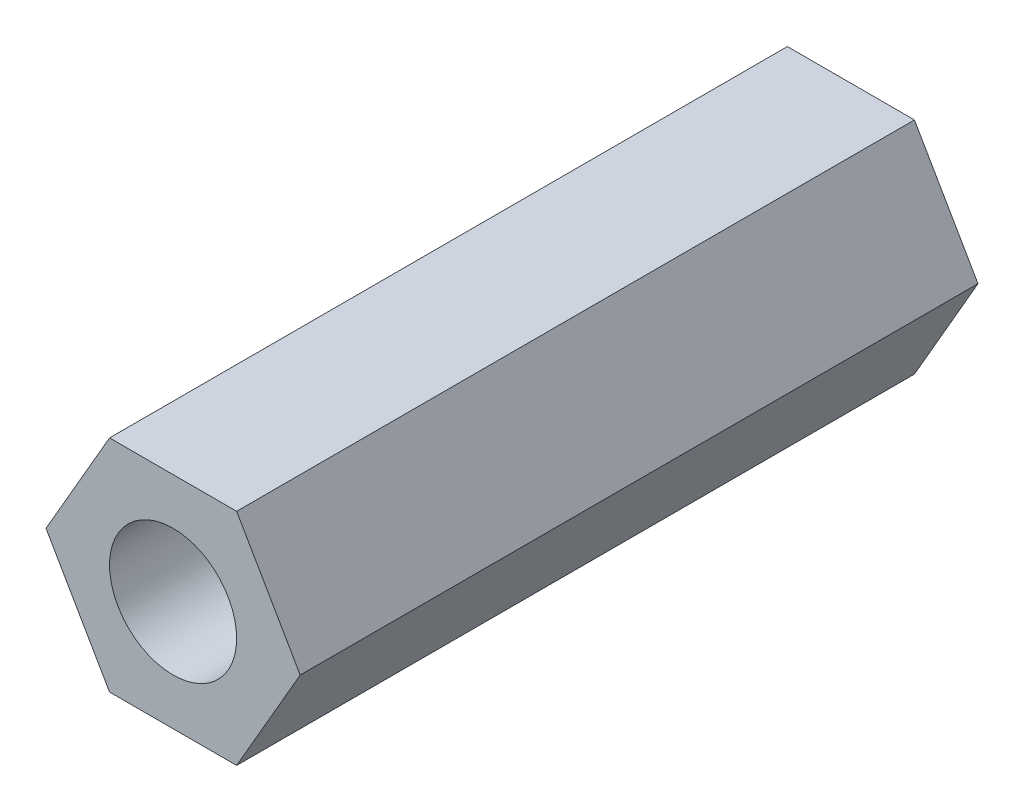
ISO-10303-21;
HEADER;
FILE_DESCRIPTION(('STEP AP214'),'2;1');
FILE_NAME('part.step','',(''),(''),'','','');
FILE_SCHEMA(('AUTOMOTIVE_DESIGN { 1 0 10303 214 1 1 1 1 }'));
ENDSEC;
DATA;
#1=APPLICATION_CONTEXT('core data for automotive mechanical design processes');
#2=APPLICATION_PROTOCOL_DEFINITION('international standard','automotive_design',2000,#1);
#3=PRODUCT_CONTEXT('',#1,'mechanical');
#4=PRODUCT('Part','Part','',(#3));
#5=PRODUCT_RELATED_PRODUCT_CATEGORY('part','',(#4));
#6=PRODUCT_DEFINITION_FORMATION('','',#4);
#7=PRODUCT_DEFINITION_CONTEXT('part definition',#1,'design');
#8=PRODUCT_DEFINITION('design','',#6,#7);
#9=PRODUCT_DEFINITION_SHAPE('','',#8);
#10=(LENGTH_UNIT() NAMED_UNIT(*) SI_UNIT(.MILLI.,.METRE.));
#11=(NAMED_UNIT(*) PLANE_ANGLE_UNIT() SI_UNIT($,.RADIAN.));
#12=(NAMED_UNIT(*) SI_UNIT($,.STERADIAN.) SOLID_ANGLE_UNIT());
#13=UNCERTAINTY_MEASURE_WITH_UNIT(LENGTH_MEASURE(1.E-05),#10,'distance_accuracy_value','');
#14=(GEOMETRIC_REPRESENTATION_CONTEXT(3) GLOBAL_UNCERTAINTY_ASSIGNED_CONTEXT((#13)) GLOBAL_UNIT_ASSIGNED_CONTEXT((#10,
#11,#12)) REPRESENTATION_CONTEXT('',''));
#15=CARTESIAN_POINT('',(0.,0.,0.));
#16=DIRECTION('',(0.,0.,1.));
#17=DIRECTION('',(1.,0.,0.));
#18=AXIS2_PLACEMENT_3D('',#15,#16,#17);
#19=CARTESIAN_POINT('',(0.,0.,16.));
#20=DIRECTION('',(0.,0.,1.));
#21=DIRECTION('',(1.,0.,0.));
#22=AXIS2_PLACEMENT_3D('',#19,#20,#21);
#23=PLANE('',#22);
#24=DIRECTION('',(-0.499897242758475,0.86608472257769,0.));
#25=VECTOR('',#24,1.);
#26=CARTESIAN_POINT('',(2.99999997888335,-0.000355949334629197,16.));
#27=LINE('',#26,#25);
#28=CARTESIAN_POINT('',(2.99999997888335,-0.000355949334629197,16.));
#29=VERTEX_POINT('',#28);
#30=CARTESIAN_POINT('',(1.50030825060792,2.59789821839844,16.));
#31=VERTEX_POINT('',#30);
#32=EDGE_CURVE('E128',#29,#31,#27,.T.);
#33=ORIENTED_EDGE('',*,*,#32,.T.);
#34=DIRECTION('',(-0.999999992961115,0.000118649778209443,0.));
#35=VECTOR('',#34,1.);
#36=CARTESIAN_POINT('',(1.50030825060792,2.59789821839844,16.));
#37=LINE('',#36,#35);
#38=CARTESIAN_POINT('',(-1.49969172827542,2.59825416773307,16.));
#39=VERTEX_POINT('',#38);
#40=EDGE_CURVE('E86',#31,#39,#37,.T.);
#41=ORIENTED_EDGE('',*,*,#40,.T.);
#42=DIRECTION('',(-0.500102750202641,-0.86596607279948,0.));
#43=VECTOR('',#42,1.);
#44=CARTESIAN_POINT('',(-1.49969172827542,2.59825416773307,16.));
#45=LINE('',#44,#43);
#46=CARTESIAN_POINT('',(-2.99999997888335,0.000355949334627463,16.));
#47=VERTEX_POINT('',#46);
#48=EDGE_CURVE('E99',#39,#47,#45,.T.);
#49=ORIENTED_EDGE('',*,*,#48,.T.);
#50=DIRECTION('',(0.499897242758475,-0.86608472257769,0.));
#51=VECTOR('',#50,1.);
#52=CARTESIAN_POINT('',(-2.99999997888335,0.000355949334627463,16.));
#53=LINE('',#52,#51);
#54=CARTESIAN_POINT('',(-1.50030825060792,-2.59789821839844,16.));
#55=VERTEX_POINT('',#54);
#56=EDGE_CURVE('E93',#47,#55,#53,.T.);
#57=ORIENTED_EDGE('',*,*,#56,.T.);
#58=DIRECTION('',(0.999999992961115,-0.000118649778209443,0.));
#59=VECTOR('',#58,1.);
#60=CARTESIAN_POINT('',(-1.50030825060792,-2.59789821839844,16.));
#61=LINE('',#60,#59);
#62=CARTESIAN_POINT('',(1.49969172827542,-2.59825416773307,16.));
#63=VERTEX_POINT('',#62);
#64=EDGE_CURVE('E97',#55,#63,#61,.T.);
#65=ORIENTED_EDGE('',*,*,#64,.T.);
#66=DIRECTION('',(0.500102750202641,0.865966072799481,0.));
#67=VECTOR('',#66,1.);
#68=CARTESIAN_POINT('',(1.49969172827542,-2.59825416773307,16.));
#69=LINE('',#68,#67);
#70=EDGE_CURVE('E49',#63,#29,#69,.T.);
#71=ORIENTED_EDGE('',*,*,#70,.T.);
#72=EDGE_LOOP('',(#33,#41,#49,#57,#65,#71));
#73=FACE_BOUND('',#72,.T.);
#74=CARTESIAN_POINT('',(0.,0.,16.));
#75=DIRECTION('',(0.,0.,1.));
#76=DIRECTION('',(1.,0.,0.));
#77=AXIS2_PLACEMENT_3D('',#74,#75,#76);
#78=CIRCLE('',#77,1.5);
#79=CARTESIAN_POINT('',(1.5,0.,16.));
#80=VERTEX_POINT('',#79);
#81=EDGE_CURVE('E121',#80,#80,#78,.T.);
#82=ORIENTED_EDGE('',*,*,#81,.F.);
#83=EDGE_LOOP('',(#82));
#84=FACE_BOUND('',#83,.T.);
#85=ADVANCED_FACE('F32',(#73,#84),#23,.T.);
#86=CARTESIAN_POINT('',(0.,0.,0.));
#87=DIRECTION('',(0.,0.,1.));
#88=DIRECTION('',(1.,0.,0.));
#89=AXIS2_PLACEMENT_3D('',#86,#87,#88);
#90=PLANE('',#89);
#91=DIRECTION('',(-0.499897242758475,0.86608472257769,0.));
#92=VECTOR('',#91,1.);
#93=CARTESIAN_POINT('',(2.99999997888335,-0.000355949334629197,0.));
#94=LINE('',#93,#92);
#95=CARTESIAN_POINT('',(2.99999997888335,-0.000355949334629197,0.));
#96=VERTEX_POINT('',#95);
#97=CARTESIAN_POINT('',(1.50030825060792,2.59789821839844,0.));
#98=VERTEX_POINT('',#97);
#99=EDGE_CURVE('E117',#96,#98,#94,.T.);
#100=ORIENTED_EDGE('',*,*,#99,.F.);
#101=DIRECTION('',(0.500102750202641,0.865966072799481,0.));
#102=VECTOR('',#101,1.);
#103=CARTESIAN_POINT('',(1.49969172827542,-2.59825416773307,0.));
#104=LINE('',#103,#102);
#105=CARTESIAN_POINT('',(1.49969172827542,-2.59825416773307,0.));
#106=VERTEX_POINT('',#105);
#107=EDGE_CURVE('E78',#106,#96,#104,.T.);
#108=ORIENTED_EDGE('',*,*,#107,.F.);
#109=DIRECTION('',(0.999999992961115,-0.000118649778209443,0.));
#110=VECTOR('',#109,1.);
#111=CARTESIAN_POINT('',(-1.50030825060792,-2.59789821839844,0.));
#112=LINE('',#111,#110);
#113=CARTESIAN_POINT('',(-1.50030825060792,-2.59789821839844,0.));
#114=VERTEX_POINT('',#113);
#115=EDGE_CURVE('E72',#114,#106,#112,.T.);
#116=ORIENTED_EDGE('',*,*,#115,.F.);
#117=DIRECTION('',(0.499897242758475,-0.86608472257769,0.));
#118=VECTOR('',#117,1.);
#119=CARTESIAN_POINT('',(-2.99999997888335,0.000355949334627463,0.));
#120=LINE('',#119,#118);
#121=CARTESIAN_POINT('',(-2.99999997888335,0.000355949334627463,0.));
#122=VERTEX_POINT('',#121);
#123=EDGE_CURVE('E107',#122,#114,#120,.T.);
#124=ORIENTED_EDGE('',*,*,#123,.F.);
#125=DIRECTION('',(-0.500102750202641,-0.86596607279948,0.));
#126=VECTOR('',#125,1.);
#127=CARTESIAN_POINT('',(-1.49969172827542,2.59825416773307,0.));
#128=LINE('',#127,#126);
#129=CARTESIAN_POINT('',(-1.49969172827542,2.59825416773307,0.));
#130=VERTEX_POINT('',#129);
#131=EDGE_CURVE('E123',#130,#122,#128,.T.);
#132=ORIENTED_EDGE('',*,*,#131,.F.);
#133=DIRECTION('',(-0.999999992961115,0.000118649778209443,0.));
#134=VECTOR('',#133,1.);
#135=CARTESIAN_POINT('',(1.50030825060792,2.59789821839844,0.));
#136=LINE('',#135,#134);
#137=EDGE_CURVE('E120',#98,#130,#136,.T.);
#138=ORIENTED_EDGE('',*,*,#137,.F.);
#139=EDGE_LOOP('',(#100,#108,#116,#124,#132,#138));
#140=FACE_BOUND('',#139,.T.);
#141=CARTESIAN_POINT('',(0.,0.,0.));
#142=DIRECTION('',(0.,0.,1.));
#143=DIRECTION('',(1.,0.,0.));
#144=AXIS2_PLACEMENT_3D('',#141,#142,#143);
#145=CIRCLE('',#144,1.5);
#146=CARTESIAN_POINT('',(1.5,0.,0.));
#147=VERTEX_POINT('',#146);
#148=EDGE_CURVE('E221',#147,#147,#145,.T.);
#149=ORIENTED_EDGE('',*,*,#148,.T.);
#150=EDGE_LOOP('',(#149));
#151=FACE_BOUND('',#150,.T.);
#152=ADVANCED_FACE('F137',(#140,#151),#90,.F.);
#153=CARTESIAN_POINT('',(2.99999997888335,-0.000355949334629197,16.));
#154=DIRECTION('',(-0.86608472257769,-0.499897242758475,0.));
#155=DIRECTION('',(0.499897242758475,-0.86608472257769,0.));
#156=AXIS2_PLACEMENT_3D('',#153,#154,#155);
#157=PLANE('',#156);
#158=ORIENTED_EDGE('',*,*,#99,.T.);
#159=DIRECTION('',(0.,0.,-1.));
#160=VECTOR('',#159,1.);
#161=CARTESIAN_POINT('',(1.50030825060792,2.59789821839844,16.));
#162=LINE('',#161,#160);
#163=EDGE_CURVE('E11',#31,#98,#162,.T.);
#164=ORIENTED_EDGE('',*,*,#163,.F.);
#165=ORIENTED_EDGE('',*,*,#32,.F.);
#166=DIRECTION('',(0.,0.,-1.));
#167=VECTOR('',#166,1.);
#168=CARTESIAN_POINT('',(2.99999997888335,-0.000355949334629197,16.));
#169=LINE('',#168,#167);
#170=EDGE_CURVE('E113',#29,#96,#169,.T.);
#171=ORIENTED_EDGE('',*,*,#170,.T.);
#172=EDGE_LOOP('',(#158,#164,#165,#171));
#173=FACE_BOUND('',#172,.T.);
#174=ADVANCED_FACE('F34',(#173),#157,.F.);
#175=CARTESIAN_POINT('',(1.50030825060792,2.59789821839844,16.));
#176=DIRECTION('',(-0.000118649778209443,-0.999999992961115,0.));
#177=DIRECTION('',(0.999999992961115,-0.000118649778209443,0.));
#178=AXIS2_PLACEMENT_3D('',#175,#176,#177);
#179=PLANE('',#178);
#180=ORIENTED_EDGE('',*,*,#137,.T.);
#181=DIRECTION('',(0.,0.,-1.));
#182=VECTOR('',#181,1.);
#183=CARTESIAN_POINT('',(-1.49969172827542,2.59825416773307,16.));
#184=LINE('',#183,#182);
#185=EDGE_CURVE('E41',#39,#130,#184,.T.);
#186=ORIENTED_EDGE('',*,*,#185,.F.);
#187=ORIENTED_EDGE('',*,*,#40,.F.);
#188=ORIENTED_EDGE('',*,*,#163,.T.);
#189=EDGE_LOOP('',(#180,#186,#187,#188));
#190=FACE_BOUND('',#189,.T.);
#191=ADVANCED_FACE('F162',(#190),#179,.F.);
#192=CARTESIAN_POINT('',(-1.49969172827542,2.59825416773307,16.));
#193=DIRECTION('',(0.865966072799481,-0.500102750202641,0.));
#194=DIRECTION('',(0.500102750202641,0.86596607279948,0.));
#195=AXIS2_PLACEMENT_3D('',#192,#193,#194);
#196=PLANE('',#195);
#197=ORIENTED_EDGE('',*,*,#131,.T.);
#198=DIRECTION('',(0.,0.,-1.));
#199=VECTOR('',#198,1.);
#200=CARTESIAN_POINT('',(-2.99999997888335,0.000355949334627463,16.));
#201=LINE('',#200,#199);
#202=EDGE_CURVE('E108',#47,#122,#201,.T.);
#203=ORIENTED_EDGE('',*,*,#202,.F.);
#204=ORIENTED_EDGE('',*,*,#48,.F.);
#205=ORIENTED_EDGE('',*,*,#185,.T.);
#206=EDGE_LOOP('',(#197,#203,#204,#205));
#207=FACE_BOUND('',#206,.T.);
#208=ADVANCED_FACE('F134',(#207),#196,.F.);
#209=CARTESIAN_POINT('',(-2.99999997888335,0.000355949334627463,16.));
#210=DIRECTION('',(0.86608472257769,0.499897242758475,0.));
#211=DIRECTION('',(-0.499897242758475,0.86608472257769,0.));
#212=AXIS2_PLACEMENT_3D('',#209,#210,#211);
#213=PLANE('',#212);
#214=ORIENTED_EDGE('',*,*,#123,.T.);
#215=DIRECTION('',(0.,0.,-1.));
#216=VECTOR('',#215,1.);
#217=CARTESIAN_POINT('',(-1.50030825060792,-2.59789821839844,16.));
#218=LINE('',#217,#216);
#219=EDGE_CURVE('E104',#55,#114,#218,.T.);
#220=ORIENTED_EDGE('',*,*,#219,.F.);
#221=ORIENTED_EDGE('',*,*,#56,.F.);
#222=ORIENTED_EDGE('',*,*,#202,.T.);
#223=EDGE_LOOP('',(#214,#220,#221,#222));
#224=FACE_BOUND('',#223,.T.);
#225=ADVANCED_FACE('F105',(#224),#213,.F.);
#226=CARTESIAN_POINT('',(-1.50030825060792,-2.59789821839844,16.));
#227=DIRECTION('',(0.000118649778209443,0.999999992961115,0.));
#228=DIRECTION('',(-0.999999992961115,0.000118649778209443,0.));
#229=AXIS2_PLACEMENT_3D('',#226,#227,#228);
#230=PLANE('',#229);
#231=ORIENTED_EDGE('',*,*,#115,.T.);
#232=DIRECTION('',(0.,0.,-1.));
#233=VECTOR('',#232,1.);
#234=CARTESIAN_POINT('',(1.49969172827542,-2.59825416773307,16.));
#235=LINE('',#234,#233);
#236=EDGE_CURVE('E109',#63,#106,#235,.T.);
#237=ORIENTED_EDGE('',*,*,#236,.F.);
#238=ORIENTED_EDGE('',*,*,#64,.F.);
#239=ORIENTED_EDGE('',*,*,#219,.T.);
#240=EDGE_LOOP('',(#231,#237,#238,#239));
#241=FACE_BOUND('',#240,.T.);
#242=ADVANCED_FACE('F111',(#241),#230,.F.);
#243=CARTESIAN_POINT('',(1.49969172827542,-2.59825416773307,16.));
#244=DIRECTION('',(-0.865966072799481,0.500102750202641,0.));
#245=DIRECTION('',(-0.500102750202641,-0.86596607279948,0.));
#246=AXIS2_PLACEMENT_3D('',#243,#244,#245);
#247=PLANE('',#246);
#248=ORIENTED_EDGE('',*,*,#107,.T.);
#249=ORIENTED_EDGE('',*,*,#170,.F.);
#250=ORIENTED_EDGE('',*,*,#70,.F.);
#251=ORIENTED_EDGE('',*,*,#236,.T.);
#252=EDGE_LOOP('',(#248,#249,#250,#251));
#253=FACE_BOUND('',#252,.T.);
#254=ADVANCED_FACE('F142',(#253),#247,.F.);
#255=CARTESIAN_POINT('',(0.,0.,16.));
#256=DIRECTION('',(0.,0.,-1.));
#257=DIRECTION('',(-1.,0.,0.));
#258=AXIS2_PLACEMENT_3D('',#255,#256,#257);
#259=CYLINDRICAL_SURFACE('',#258,1.5);
#260=ORIENTED_EDGE('',*,*,#81,.T.);
#261=EDGE_LOOP('',(#260));
#262=FACE_BOUND('',#261,.T.);
#263=ORIENTED_EDGE('',*,*,#148,.F.);
#264=EDGE_LOOP('',(#263));
#265=FACE_BOUND('',#264,.T.);
#266=ADVANCED_FACE('F144',(#262,#265),#259,.F.);
#267=CLOSED_SHELL('',(#85,#152,#174,#191,#208,#225,#242,#254,#266));
#268=MANIFOLD_SOLID_BREP('B2',#267);
#269=ADVANCED_BREP_SHAPE_REPRESENTATION('',(#18,#268),#14);
#270=SHAPE_DEFINITION_REPRESENTATION(#9,#269);
ENDSEC;
END-ISO-10303-21;
